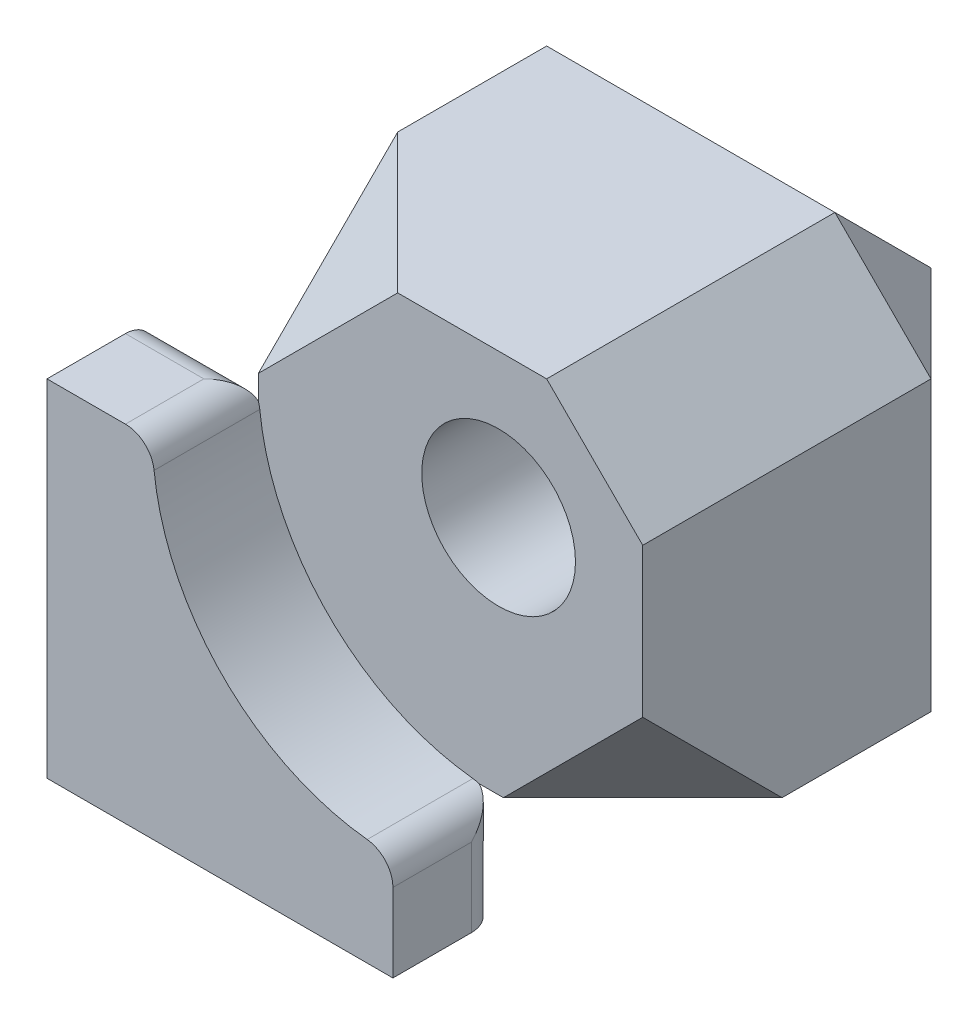
ISO-10303-21;
HEADER;
FILE_DESCRIPTION(('STEP AP214'),'2;1');
FILE_NAME('part.step','',(''),(''),'','','');
FILE_SCHEMA(('AUTOMOTIVE_DESIGN { 1 0 10303 214 1 1 1 1 }'));
ENDSEC;
DATA;
#1=APPLICATION_CONTEXT('core data for automotive mechanical design processes');
#2=APPLICATION_PROTOCOL_DEFINITION('international standard','automotive_design',2000,#1);
#3=PRODUCT_CONTEXT('',#1,'mechanical');
#4=PRODUCT('Part','Part','',(#3));
#5=PRODUCT_RELATED_PRODUCT_CATEGORY('part','',(#4));
#6=PRODUCT_DEFINITION_FORMATION('','',#4);
#7=PRODUCT_DEFINITION_CONTEXT('part definition',#1,'design');
#8=PRODUCT_DEFINITION('design','',#6,#7);
#9=PRODUCT_DEFINITION_SHAPE('','',#8);
#10=(LENGTH_UNIT() NAMED_UNIT(*) SI_UNIT(.MILLI.,.METRE.));
#11=(NAMED_UNIT(*) PLANE_ANGLE_UNIT() SI_UNIT($,.RADIAN.));
#12=(NAMED_UNIT(*) SI_UNIT($,.STERADIAN.) SOLID_ANGLE_UNIT());
#13=UNCERTAINTY_MEASURE_WITH_UNIT(LENGTH_MEASURE(1.E-05),#10,'distance_accuracy_value','');
#14=(GEOMETRIC_REPRESENTATION_CONTEXT(3) GLOBAL_UNCERTAINTY_ASSIGNED_CONTEXT((#13)) GLOBAL_UNIT_ASSIGNED_CONTEXT((#10,
#11,#12)) REPRESENTATION_CONTEXT('',''));
#15=CARTESIAN_POINT('',(0.,0.,0.));
#16=DIRECTION('',(0.,0.,1.));
#17=DIRECTION('',(1.,0.,0.));
#18=AXIS2_PLACEMENT_3D('',#15,#16,#17);
#19=CARTESIAN_POINT('',(0.,-2.50000000000001,7.5));
#20=DIRECTION('',(-1.,0.,0.));
#21=DIRECTION('',(0.,1.,0.));
#22=AXIS2_PLACEMENT_3D('',#19,#20,#21);
#23=PLANE('',#22);
#24=DIRECTION('',(0.,0.,1.));
#25=VECTOR('',#24,1.);
#26=CARTESIAN_POINT('',(0.,-2.20000000000001,7.5));
#27=LINE('',#26,#25);
#28=CARTESIAN_POINT('',(0.,-2.20000000000001,5.56776436283003));
#29=VERTEX_POINT('',#28);
#30=CARTESIAN_POINT('',(0.,-2.20000000000001,7.2));
#31=VERTEX_POINT('',#30);
#32=EDGE_CURVE('E70',#29,#31,#27,.T.);
#33=ORIENTED_EDGE('',*,*,#32,.F.);
#34=DIRECTION('',(0.,1.,0.));
#35=VECTOR('',#34,1.);
#36=CARTESIAN_POINT('',(0.,-2.50000000000001,5.56776436283003));
#37=LINE('',#36,#35);
#38=CARTESIAN_POINT('',(0.,-0.567764362830031,5.56776436283003));
#39=VERTEX_POINT('',#38);
#40=EDGE_CURVE('E267',#29,#39,#37,.T.);
#41=ORIENTED_EDGE('',*,*,#40,.T.);
#42=DIRECTION('',(0.,0.,-1.));
#43=VECTOR('',#42,1.);
#44=CARTESIAN_POINT('',(0.,-0.567764362830031,7.5));
#45=LINE('',#44,#43);
#46=CARTESIAN_POINT('',(0.,-0.56776436283003,7.2));
#47=VERTEX_POINT('',#46);
#48=EDGE_CURVE('E288',#39,#47,#45,.F.);
#49=ORIENTED_EDGE('',*,*,#48,.T.);
#50=DIRECTION('',(0.,1.,0.));
#51=VECTOR('',#50,1.);
#52=CARTESIAN_POINT('',(0.,-2.50000000000001,7.2));
#53=LINE('',#52,#51);
#54=EDGE_CURVE('E457',#31,#47,#53,.T.);
#55=ORIENTED_EDGE('',*,*,#54,.F.);
#56=EDGE_LOOP('',(#33,#41,#49,#55));
#57=FACE_BOUND('',#56,.T.);
#58=ADVANCED_FACE('F51',(#57),#23,.F.);
#59=CARTESIAN_POINT('',(-7.20000000000001,0.,0.));
#60=DIRECTION('',(-1.,0.,0.));
#61=DIRECTION('',(0.,-1.,0.));
#62=AXIS2_PLACEMENT_3D('',#59,#60,#61);
#63=PLANE('',#62);
#64=DIRECTION('',(0.,-1.,0.));
#65=VECTOR('',#64,1.);
#66=CARTESIAN_POINT('',(-7.20000000000001,-2.5,0.));
#67=LINE('',#66,#65);
#68=CARTESIAN_POINT('',(-7.20000000000001,-0.567764362830022,0.));
#69=VERTEX_POINT('',#68);
#70=CARTESIAN_POINT('',(-7.20000000000001,-2.20000000000001,0.));
#71=VERTEX_POINT('',#70);
#72=EDGE_CURVE('E212',#69,#71,#67,.T.);
#73=ORIENTED_EDGE('',*,*,#72,.T.);
#74=DIRECTION('',(0.,0.,1.));
#75=VECTOR('',#74,1.);
#76=CARTESIAN_POINT('',(-7.20000000000001,-2.20000000000001,0.));
#77=LINE('',#76,#75);
#78=CARTESIAN_POINT('',(-7.20000000000001,-2.20000000000001,7.2));
#79=VERTEX_POINT('',#78);
#80=EDGE_CURVE('E203',#71,#79,#77,.T.);
#81=ORIENTED_EDGE('',*,*,#80,.T.);
#82=DIRECTION('',(0.,1.,0.));
#83=VECTOR('',#82,1.);
#84=CARTESIAN_POINT('',(-7.20000000000001,0.,7.2));
#85=LINE('',#84,#83);
#86=CARTESIAN_POINT('',(-7.20000000000001,4.99999999999999,7.2));
#87=VERTEX_POINT('',#86);
#88=EDGE_CURVE('E58',#79,#87,#85,.T.);
#89=ORIENTED_EDGE('',*,*,#88,.T.);
#90=DIRECTION('',(0.,0.,-1.));
#91=VECTOR('',#90,1.);
#92=CARTESIAN_POINT('',(-7.20000000000001,4.99999999999999,7.5));
#93=LINE('',#92,#91);
#94=CARTESIAN_POINT('',(-7.20000000000001,4.99999999999999,5.56776436283002));
#95=VERTEX_POINT('',#94);
#96=EDGE_CURVE('E356',#87,#95,#93,.T.);
#97=ORIENTED_EDGE('',*,*,#96,.T.);
#98=CARTESIAN_POINT('',(-7.20000000000001,4.39999999999999,5.56776436283002));
#99=DIRECTION('',(-1.,0.,0.));
#100=DIRECTION('',(0.,-1.,0.));
#101=AXIS2_PLACEMENT_3D('',#98,#99,#100);
#102=CIRCLE('',#101,0.6);
#103=CARTESIAN_POINT('',(-7.20000000000001,4.46428571428571,4.97121818109823));
#104=VERTEX_POINT('',#103);
#105=EDGE_CURVE('E443',#104,#95,#102,.F.);
#106=ORIENTED_EDGE('',*,*,#105,.F.);
#107=CARTESIAN_POINT('',(-7.20000000000001,5.00000000000001,0.));
#108=DIRECTION('',(-1.,0.,0.));
#109=DIRECTION('',(0.,-1.,0.));
#110=AXIS2_PLACEMENT_3D('',#107,#108,#109);
#111=CIRCLE('',#110,5.00000000000001);
#112=CARTESIAN_POINT('',(-7.20000000000001,0.028781818901767,0.535714285714285));
#113=VERTEX_POINT('',#112);
#114=EDGE_CURVE('E450',#104,#113,#111,.F.);
#115=ORIENTED_EDGE('',*,*,#114,.T.);
#116=CARTESIAN_POINT('',(-7.20000000000001,-0.567764362830021,0.6));
#117=DIRECTION('',(-1.,0.,0.));
#118=DIRECTION('',(0.,-1.,0.));
#119=AXIS2_PLACEMENT_3D('',#116,#117,#118);
#120=CIRCLE('',#119,0.6);
#121=EDGE_CURVE('E217',#69,#113,#120,.F.);
#122=ORIENTED_EDGE('',*,*,#121,.F.);
#123=EDGE_LOOP('',(#73,#81,#89,#97,#106,#115,#122));
#124=FACE_BOUND('',#123,.T.);
#125=ADVANCED_FACE('F206',(#124),#63,.T.);
#126=CARTESIAN_POINT('',(-7.5,-2.5,0.));
#127=DIRECTION('',(0.,0.,1.));
#128=DIRECTION('',(0.,-1.,0.));
#129=AXIS2_PLACEMENT_3D('',#126,#127,#128);
#130=PLANE('',#129);
#131=DIRECTION('',(1.,0.,0.));
#132=VECTOR('',#131,1.);
#133=CARTESIAN_POINT('',(-7.5,-2.20000000000001,0.));
#134=LINE('',#133,#132);
#135=CARTESIAN_POINT('',(-5.56776436283003,-2.20000000000001,0.));
#136=VERTEX_POINT('',#135);
#137=EDGE_CURVE('E474',#71,#136,#134,.T.);
#138=ORIENTED_EDGE('',*,*,#137,.F.);
#139=ORIENTED_EDGE('',*,*,#72,.F.);
#140=DIRECTION('',(1.,0.,0.));
#141=VECTOR('',#140,1.);
#142=CARTESIAN_POINT('',(-7.5,-0.567764362830022,0.));
#143=LINE('',#142,#141);
#144=CARTESIAN_POINT('',(-5.56776436283003,-0.567764362830022,0.));
#145=VERTEX_POINT('',#144);
#146=EDGE_CURVE('E290',#69,#145,#143,.T.);
#147=ORIENTED_EDGE('',*,*,#146,.T.);
#148=DIRECTION('',(0.,1.,0.));
#149=VECTOR('',#148,1.);
#150=CARTESIAN_POINT('',(-5.56776436283003,-2.5,0.));
#151=LINE('',#150,#149);
#152=EDGE_CURVE('E317',#145,#136,#151,.F.);
#153=ORIENTED_EDGE('',*,*,#152,.T.);
#154=EDGE_LOOP('',(#138,#139,#147,#153));
#155=FACE_BOUND('',#154,.T.);
#156=ADVANCED_FACE('F586',(#155),#130,.F.);
#157=CARTESIAN_POINT('',(0.,-2.5,0.));
#158=DIRECTION('',(0.,1.,0.));
#159=DIRECTION('',(1.,0.,0.));
#160=AXIS2_PLACEMENT_3D('',#157,#158,#159);
#161=CYLINDRICAL_SURFACE('',#160,5.00000000000001);
#162=CARTESIAN_POINT('',(0.,-2.20000000000001,0.));
#163=DIRECTION('',(0.,-1.,0.));
#164=DIRECTION('',(1.,0.,0.));
#165=AXIS2_PLACEMENT_3D('',#162,#163,#164);
#166=CIRCLE('',#165,5.00000000000001);
#167=CARTESIAN_POINT('',(-4.97121818109824,-2.20000000000001,0.535714285714286));
#168=VERTEX_POINT('',#167);
#169=CARTESIAN_POINT('',(-0.535714285714296,-2.20000000000001,4.97121818109824));
#170=VERTEX_POINT('',#169);
#171=EDGE_CURVE('E471',#168,#170,#166,.F.);
#172=ORIENTED_EDGE('',*,*,#171,.F.);
#173=DIRECTION('',(0.,1.,0.));
#174=VECTOR('',#173,1.);
#175=CARTESIAN_POINT('',(-4.97121818109824,-2.5,0.535714285714286));
#176=LINE('',#175,#174);
#177=CARTESIAN_POINT('',(-4.97121818109824,0.,0.535714285714286));
#178=VERTEX_POINT('',#177);
#179=EDGE_CURVE('E316',#168,#178,#176,.T.);
#180=ORIENTED_EDGE('',*,*,#179,.T.);
#181=CARTESIAN_POINT('',(0.,0.,0.));
#182=DIRECTION('',(0.,1.,0.));
#183=DIRECTION('',(1.,0.,0.));
#184=AXIS2_PLACEMENT_3D('',#181,#182,#183);
#185=CIRCLE('',#184,5.00000000000001);
#186=CARTESIAN_POINT('',(-0.535714285714296,0.,4.97121818109824));
#187=VERTEX_POINT('',#186);
#188=EDGE_CURVE('E341',#178,#187,#185,.T.);
#189=ORIENTED_EDGE('',*,*,#188,.T.);
#190=DIRECTION('',(0.,1.,0.));
#191=VECTOR('',#190,1.);
#192=CARTESIAN_POINT('',(-0.535714285714296,-2.5,4.97121818109824));
#193=LINE('',#192,#191);
#194=EDGE_CURVE('E265',#187,#170,#193,.F.);
#195=ORIENTED_EDGE('',*,*,#194,.T.);
#196=EDGE_LOOP('',(#172,#180,#189,#195));
#197=FACE_BOUND('',#196,.T.);
#198=ADVANCED_FACE('F487',(#197),#161,.F.);
#199=CARTESIAN_POINT('',(-5.56776436283003,-2.5,0.600000000000001));
#200=DIRECTION('',(0.,1.,0.));
#201=DIRECTION('',(0.,0.,1.));
#202=AXIS2_PLACEMENT_3D('',#199,#200,#201);
#203=CYLINDRICAL_SURFACE('',#202,0.6);
#204=ORIENTED_EDGE('',*,*,#179,.F.);
#205=CARTESIAN_POINT('',(-5.56776436283003,-2.20000000000001,0.600000000000001));
#206=DIRECTION('',(0.,-1.,0.));
#207=DIRECTION('',(1.,0.,0.));
#208=AXIS2_PLACEMENT_3D('',#205,#206,#207);
#209=CIRCLE('',#208,0.6);
#210=EDGE_CURVE('E468',#168,#136,#209,.F.);
#211=ORIENTED_EDGE('',*,*,#210,.T.);
#212=ORIENTED_EDGE('',*,*,#152,.F.);
#213=CARTESIAN_POINT('',(-5.56776436283003,-0.567764362830021,0.600000000000001));
#214=DIRECTION('',(-0.707106781186547,0.707106781186547,0.));
#215=DIRECTION('',(0.707106781186547,0.707106781186547,0.));
#216=AXIS2_PLACEMENT_3D('',#213,#214,#215);
#217=ELLIPSE('',#216,0.848528137423857,0.6);
#218=CARTESIAN_POINT('',(-5.,0.,0.40598034042849));
#219=VERTEX_POINT('',#218);
#220=EDGE_CURVE('E284',#145,#219,#217,.F.);
#221=ORIENTED_EDGE('',*,*,#220,.T.);
#222=CARTESIAN_POINT('',(-5.56776436283003,0.,0.600000000000001));
#223=DIRECTION('',(0.,-1.,0.));
#224=DIRECTION('',(0.,0.,-1.));
#225=AXIS2_PLACEMENT_3D('',#222,#223,#224);
#226=CIRCLE('',#225,0.6);
#227=EDGE_CURVE('E303',#178,#219,#226,.F.);
#228=ORIENTED_EDGE('',*,*,#227,.F.);
#229=EDGE_LOOP('',(#204,#211,#212,#221,#228));
#230=FACE_BOUND('',#229,.T.);
#231=ADVANCED_FACE('F499',(#230),#203,.T.);
#232=CARTESIAN_POINT('',(-0.600000000000011,-2.5,5.56776436283003));
#233=DIRECTION('',(0.,1.,0.));
#234=DIRECTION('',(0.,0.,1.));
#235=AXIS2_PLACEMENT_3D('',#232,#233,#234);
#236=CYLINDRICAL_SURFACE('',#235,0.6);
#237=ORIENTED_EDGE('',*,*,#40,.F.);
#238=CARTESIAN_POINT('',(-0.600000000000011,-2.20000000000001,5.56776436283003));
#239=DIRECTION('',(0.,-1.,0.));
#240=DIRECTION('',(1.,0.,0.));
#241=AXIS2_PLACEMENT_3D('',#238,#239,#240);
#242=CIRCLE('',#241,0.6);
#243=EDGE_CURVE('E477',#29,#170,#242,.F.);
#244=ORIENTED_EDGE('',*,*,#243,.T.);
#245=ORIENTED_EDGE('',*,*,#194,.F.);
#246=CARTESIAN_POINT('',(-0.600000000000011,0.,5.56776436283003));
#247=DIRECTION('',(0.,-1.,0.));
#248=DIRECTION('',(0.,0.,-1.));
#249=AXIS2_PLACEMENT_3D('',#246,#247,#248);
#250=CIRCLE('',#249,0.6);
#251=CARTESIAN_POINT('',(-0.405980340428505,0.,5.));
#252=VERTEX_POINT('',#251);
#253=EDGE_CURVE('E260',#252,#187,#250,.F.);
#254=ORIENTED_EDGE('',*,*,#253,.F.);
#255=CARTESIAN_POINT('',(-0.600000000000011,-0.56776436283003,5.56776436283003));
#256=DIRECTION('',(0.,-0.707106781186547,-0.707106781186547));
#257=DIRECTION('',(0.,0.707106781186547,-0.707106781186547));
#258=AXIS2_PLACEMENT_3D('',#255,#256,#257);
#259=ELLIPSE('',#258,0.848528137423857,0.6);
#260=EDGE_CURVE('E266',#39,#252,#259,.F.);
#261=ORIENTED_EDGE('',*,*,#260,.F.);
#262=EDGE_LOOP('',(#237,#244,#245,#254,#261));
#263=FACE_BOUND('',#262,.T.);
#264=ADVANCED_FACE('F52',(#263),#236,.T.);
#265=CARTESIAN_POINT('',(0.,0.,7.2));
#266=DIRECTION('',(0.,0.,1.));
#267=DIRECTION('',(1.,0.,0.));
#268=AXIS2_PLACEMENT_3D('',#265,#266,#267);
#269=PLANE('',#268);
#270=ORIENTED_EDGE('',*,*,#88,.F.);
#271=DIRECTION('',(1.,0.,0.));
#272=VECTOR('',#271,1.);
#273=CARTESIAN_POINT('',(0.,-2.20000000000001,7.2));
#274=LINE('',#273,#272);
#275=EDGE_CURVE('E11',#79,#31,#274,.T.);
#276=ORIENTED_EDGE('',*,*,#275,.T.);
#277=ORIENTED_EDGE('',*,*,#54,.T.);
#278=CARTESIAN_POINT('',(-0.60000000000001,-0.56776436283003,7.2));
#279=DIRECTION('',(0.,0.,1.));
#280=DIRECTION('',(1.,0.,0.));
#281=AXIS2_PLACEMENT_3D('',#278,#279,#280);
#282=CIRCLE('',#281,0.6);
#283=CARTESIAN_POINT('',(-0.535714285714295,0.0287818189017583,7.2));
#284=VERTEX_POINT('',#283);
#285=EDGE_CURVE('E455',#284,#47,#282,.F.);
#286=ORIENTED_EDGE('',*,*,#285,.F.);
#287=CARTESIAN_POINT('',(0.,5.,7.2));
#288=DIRECTION('',(0.,0.,1.));
#289=DIRECTION('',(1.,0.,0.));
#290=AXIS2_PLACEMENT_3D('',#287,#288,#289);
#291=CIRCLE('',#290,5.00000000000001);
#292=CARTESIAN_POINT('',(-4.97121818109824,4.46428571428571,7.2));
#293=VERTEX_POINT('',#292);
#294=EDGE_CURVE('E459',#284,#293,#291,.F.);
#295=ORIENTED_EDGE('',*,*,#294,.T.);
#296=CARTESIAN_POINT('',(-5.56776436283003,4.39999999999999,7.2));
#297=DIRECTION('',(0.,0.,1.));
#298=DIRECTION('',(1.,0.,0.));
#299=AXIS2_PLACEMENT_3D('',#296,#297,#298);
#300=CIRCLE('',#299,0.6);
#301=CARTESIAN_POINT('',(-5.56776436283003,4.99999999999999,7.2));
#302=VERTEX_POINT('',#301);
#303=EDGE_CURVE('E465',#302,#293,#300,.F.);
#304=ORIENTED_EDGE('',*,*,#303,.F.);
#305=DIRECTION('',(-1.,0.,0.));
#306=VECTOR('',#305,1.);
#307=CARTESIAN_POINT('',(-7.50000000000001,4.99999999999999,7.2));
#308=LINE('',#307,#306);
#309=EDGE_CURVE('E216',#302,#87,#308,.T.);
#310=ORIENTED_EDGE('',*,*,#309,.T.);
#311=EDGE_LOOP('',(#270,#276,#277,#286,#295,#304,#310));
#312=FACE_BOUND('',#311,.T.);
#313=ADVANCED_FACE('F211',(#312),#269,.T.);
#314=CARTESIAN_POINT('',(-7.50000000000001,4.99999999999999,7.5));
#315=DIRECTION('',(0.,-1.,0.));
#316=DIRECTION('',(-1.,0.,0.));
#317=AXIS2_PLACEMENT_3D('',#314,#315,#316);
#318=PLANE('',#317);
#319=ORIENTED_EDGE('',*,*,#309,.F.);
#320=DIRECTION('',(0.,0.,-1.));
#321=VECTOR('',#320,1.);
#322=CARTESIAN_POINT('',(-5.56776436283003,4.99999999999999,7.5));
#323=LINE('',#322,#321);
#324=CARTESIAN_POINT('',(-5.56776436283003,4.99999999999999,5.56776436283002));
#325=VERTEX_POINT('',#324);
#326=EDGE_CURVE('E314',#302,#325,#323,.T.);
#327=ORIENTED_EDGE('',*,*,#326,.T.);
#328=DIRECTION('',(1.,0.,0.));
#329=VECTOR('',#328,1.);
#330=CARTESIAN_POINT('',(-7.50000000000001,4.99999999999999,5.56776436283002));
#331=LINE('',#330,#329);
#332=EDGE_CURVE('E330',#325,#95,#331,.F.);
#333=ORIENTED_EDGE('',*,*,#332,.T.);
#334=ORIENTED_EDGE('',*,*,#96,.F.);
#335=EDGE_LOOP('',(#319,#327,#333,#334));
#336=FACE_BOUND('',#335,.T.);
#337=ADVANCED_FACE('F592',(#336),#318,.F.);
#338=CARTESIAN_POINT('',(0.,5.,7.5));
#339=DIRECTION('',(0.,0.,-1.));
#340=DIRECTION('',(0.,1.,0.));
#341=AXIS2_PLACEMENT_3D('',#338,#339,#340);
#342=CYLINDRICAL_SURFACE('',#341,5.00000000000001);
#343=ORIENTED_EDGE('',*,*,#294,.F.);
#344=DIRECTION('',(0.,0.,-1.));
#345=VECTOR('',#344,1.);
#346=CARTESIAN_POINT('',(-0.535714285714295,0.0287818189017583,7.5));
#347=LINE('',#346,#345);
#348=CARTESIAN_POINT('',(-0.535714285714295,0.0287818189017583,5.));
#349=VERTEX_POINT('',#348);
#350=EDGE_CURVE('E292',#284,#349,#347,.T.);
#351=ORIENTED_EDGE('',*,*,#350,.T.);
#352=CARTESIAN_POINT('',(0.,5.,5.));
#353=DIRECTION('',(0.,0.,-1.));
#354=DIRECTION('',(0.,1.,0.));
#355=AXIS2_PLACEMENT_3D('',#352,#353,#354);
#356=CIRCLE('',#355,5.00000000000001);
#357=CARTESIAN_POINT('',(-4.97121818109824,4.46428571428571,5.));
#358=VERTEX_POINT('',#357);
#359=EDGE_CURVE('E335',#349,#358,#356,.T.);
#360=ORIENTED_EDGE('',*,*,#359,.T.);
#361=DIRECTION('',(0.,0.,-1.));
#362=VECTOR('',#361,1.);
#363=CARTESIAN_POINT('',(-4.97121818109824,4.46428571428571,7.5));
#364=LINE('',#363,#362);
#365=EDGE_CURVE('E302',#358,#293,#364,.F.);
#366=ORIENTED_EDGE('',*,*,#365,.T.);
#367=EDGE_LOOP('',(#343,#351,#360,#366));
#368=FACE_BOUND('',#367,.T.);
#369=ADVANCED_FACE('F595',(#368),#342,.F.);
#370=CARTESIAN_POINT('',(-5.56776436283003,4.39999999999999,7.5));
#371=DIRECTION('',(0.,0.,-1.));
#372=DIRECTION('',(-1.,0.,0.));
#373=AXIS2_PLACEMENT_3D('',#370,#371,#372);
#374=CYLINDRICAL_SURFACE('',#373,0.6);
#375=ORIENTED_EDGE('',*,*,#326,.F.);
#376=ORIENTED_EDGE('',*,*,#303,.T.);
#377=ORIENTED_EDGE('',*,*,#365,.F.);
#378=CARTESIAN_POINT('',(-5.56776436283003,4.39999999999999,5.));
#379=DIRECTION('',(0.,0.,-1.));
#380=DIRECTION('',(-1.,0.,0.));
#381=AXIS2_PLACEMENT_3D('',#378,#379,#380);
#382=CIRCLE('',#381,0.6);
#383=CARTESIAN_POINT('',(-5.,4.59401965957153,5.));
#384=VERTEX_POINT('',#383);
#385=EDGE_CURVE('E299',#384,#358,#382,.T.);
#386=ORIENTED_EDGE('',*,*,#385,.F.);
#387=CARTESIAN_POINT('',(-5.56776436283003,4.39999999999999,5.56776436283002));
#388=DIRECTION('',(0.707106781186547,0.,0.707106781186547));
#389=DIRECTION('',(0.707106781186547,0.,-0.707106781186547));
#390=AXIS2_PLACEMENT_3D('',#387,#388,#389);
#391=ELLIPSE('',#390,0.848528137423857,0.6);
#392=EDGE_CURVE('E309',#325,#384,#391,.F.);
#393=ORIENTED_EDGE('',*,*,#392,.F.);
#394=EDGE_LOOP('',(#375,#376,#377,#386,#393));
#395=FACE_BOUND('',#394,.T.);
#396=ADVANCED_FACE('F528',(#395),#374,.T.);
#397=CARTESIAN_POINT('',(-0.60000000000001,-0.56776436283003,7.5));
#398=DIRECTION('',(0.,0.,-1.));
#399=DIRECTION('',(-1.,0.,0.));
#400=AXIS2_PLACEMENT_3D('',#397,#398,#399);
#401=CYLINDRICAL_SURFACE('',#400,0.6);
#402=ORIENTED_EDGE('',*,*,#350,.F.);
#403=ORIENTED_EDGE('',*,*,#285,.T.);
#404=ORIENTED_EDGE('',*,*,#48,.F.);
#405=ORIENTED_EDGE('',*,*,#260,.T.);
#406=CARTESIAN_POINT('',(-0.60000000000001,-0.56776436283003,5.));
#407=DIRECTION('',(0.,0.,-1.));
#408=DIRECTION('',(-1.,0.,0.));
#409=AXIS2_PLACEMENT_3D('',#406,#407,#408);
#410=CIRCLE('',#409,0.6);
#411=EDGE_CURVE('E274',#349,#252,#410,.T.);
#412=ORIENTED_EDGE('',*,*,#411,.F.);
#413=EDGE_LOOP('',(#402,#403,#404,#405,#412));
#414=FACE_BOUND('',#413,.T.);
#415=ADVANCED_FACE('F604',(#414),#401,.T.);
#416=CARTESIAN_POINT('',(-7.5,5.00000000000001,0.));
#417=DIRECTION('',(1.,0.,0.));
#418=DIRECTION('',(0.,0.,-1.));
#419=AXIS2_PLACEMENT_3D('',#416,#417,#418);
#420=CYLINDRICAL_SURFACE('',#419,5.00000000000001);
#421=ORIENTED_EDGE('',*,*,#114,.F.);
#422=DIRECTION('',(1.,0.,0.));
#423=VECTOR('',#422,1.);
#424=CARTESIAN_POINT('',(-7.5,4.46428571428571,4.97121818109823));
#425=LINE('',#424,#423);
#426=CARTESIAN_POINT('',(-5.,4.46428571428571,4.97121818109823));
#427=VERTEX_POINT('',#426);
#428=EDGE_CURVE('E333',#104,#427,#425,.T.);
#429=ORIENTED_EDGE('',*,*,#428,.T.);
#430=CARTESIAN_POINT('',(-5.,5.00000000000001,0.));
#431=DIRECTION('',(1.,0.,0.));
#432=DIRECTION('',(0.,0.,-1.));
#433=AXIS2_PLACEMENT_3D('',#430,#431,#432);
#434=CIRCLE('',#433,5.00000000000001);
#435=CARTESIAN_POINT('',(-5.,0.028781818901767,0.535714285714285));
#436=VERTEX_POINT('',#435);
#437=EDGE_CURVE('E340',#427,#436,#434,.T.);
#438=ORIENTED_EDGE('',*,*,#437,.T.);
#439=DIRECTION('',(1.,0.,0.));
#440=VECTOR('',#439,1.);
#441=CARTESIAN_POINT('',(-7.5,0.028781818901767,0.535714285714285));
#442=LINE('',#441,#440);
#443=EDGE_CURVE('E278',#436,#113,#442,.F.);
#444=ORIENTED_EDGE('',*,*,#443,.T.);
#445=EDGE_LOOP('',(#421,#429,#438,#444));
#446=FACE_BOUND('',#445,.T.);
#447=ADVANCED_FACE('F514',(#446),#420,.F.);
#448=CARTESIAN_POINT('',(-7.5,4.39999999999999,5.56776436283002));
#449=DIRECTION('',(1.,0.,0.));
#450=DIRECTION('',(0.,0.,-1.));
#451=AXIS2_PLACEMENT_3D('',#448,#449,#450);
#452=CYLINDRICAL_SURFACE('',#451,0.6);
#453=ORIENTED_EDGE('',*,*,#428,.F.);
#454=ORIENTED_EDGE('',*,*,#105,.T.);
#455=ORIENTED_EDGE('',*,*,#332,.F.);
#456=ORIENTED_EDGE('',*,*,#392,.T.);
#457=CARTESIAN_POINT('',(-5.,4.39999999999999,5.56776436283002));
#458=DIRECTION('',(1.,0.,0.));
#459=DIRECTION('',(0.,0.,-1.));
#460=AXIS2_PLACEMENT_3D('',#457,#458,#459);
#461=CIRCLE('',#460,0.6);
#462=EDGE_CURVE('E322',#427,#384,#461,.T.);
#463=ORIENTED_EDGE('',*,*,#462,.F.);
#464=EDGE_LOOP('',(#453,#454,#455,#456,#463));
#465=FACE_BOUND('',#464,.T.);
#466=ADVANCED_FACE('F520',(#465),#452,.T.);
#467=CARTESIAN_POINT('',(-7.5,-0.567764362830021,0.6));
#468=DIRECTION('',(1.,0.,0.));
#469=DIRECTION('',(0.,0.,-1.));
#470=AXIS2_PLACEMENT_3D('',#467,#468,#469);
#471=CYLINDRICAL_SURFACE('',#470,0.6);
#472=ORIENTED_EDGE('',*,*,#146,.F.);
#473=ORIENTED_EDGE('',*,*,#121,.T.);
#474=ORIENTED_EDGE('',*,*,#443,.F.);
#475=CARTESIAN_POINT('',(-5.,-0.567764362830021,0.6));
#476=DIRECTION('',(1.,0.,0.));
#477=DIRECTION('',(0.,0.,-1.));
#478=AXIS2_PLACEMENT_3D('',#475,#476,#477);
#479=CIRCLE('',#478,0.6);
#480=EDGE_CURVE('E275',#219,#436,#479,.T.);
#481=ORIENTED_EDGE('',*,*,#480,.F.);
#482=ORIENTED_EDGE('',*,*,#220,.F.);
#483=EDGE_LOOP('',(#472,#473,#474,#481,#482));
#484=FACE_BOUND('',#483,.T.);
#485=ADVANCED_FACE('F504',(#484),#471,.T.);
#486=CARTESIAN_POINT('',(0.,0.,0.));
#487=DIRECTION('',(0.,-1.,0.));
#488=DIRECTION('',(0.,0.,-1.));
#489=AXIS2_PLACEMENT_3D('',#486,#487,#488);
#490=PLANE('',#489);
#491=CARTESIAN_POINT('',(0.,0.,0.));
#492=DIRECTION('',(0.,-1.,0.));
#493=DIRECTION('',(0.,0.,-1.));
#494=AXIS2_PLACEMENT_3D('',#491,#492,#493);
#495=CIRCLE('',#494,1.6);
#496=CARTESIAN_POINT('',(0.,0.,-1.6));
#497=VERTEX_POINT('',#496);
#498=EDGE_CURVE('E407',#497,#497,#495,.T.);
#499=ORIENTED_EDGE('',*,*,#498,.F.);
#500=EDGE_LOOP('',(#499));
#501=FACE_BOUND('',#500,.T.);
#502=DIRECTION('',(0.,0.,1.));
#503=VECTOR('',#502,1.);
#504=CARTESIAN_POINT('',(-5.,0.,5.));
#505=LINE('',#504,#503);
#506=CARTESIAN_POINT('',(-5.,0.,-0.100000000000001));
#507=VERTEX_POINT('',#506);
#508=EDGE_CURVE('E394',#507,#219,#505,.T.);
#509=ORIENTED_EDGE('',*,*,#508,.F.);
#510=DIRECTION('',(0.707106781186548,0.,-0.707106781186548));
#511=VECTOR('',#510,1.);
#512=CARTESIAN_POINT('',(-2.55,0.,-2.55));
#513=LINE('',#512,#511);
#514=CARTESIAN_POINT('',(-2.10000000000001,0.,-3.));
#515=VERTEX_POINT('',#514);
#516=EDGE_CURVE('E235',#507,#515,#513,.T.);
#517=ORIENTED_EDGE('',*,*,#516,.T.);
#518=DIRECTION('',(-1.,0.,0.));
#519=VECTOR('',#518,1.);
#520=CARTESIAN_POINT('',(19.142135623731,0.,-3.));
#521=LINE('',#520,#519);
#522=CARTESIAN_POINT('',(0.999999999999994,0.,-3.));
#523=VERTEX_POINT('',#522);
#524=EDGE_CURVE('E423',#523,#515,#521,.T.);
#525=ORIENTED_EDGE('',*,*,#524,.F.);
#526=DIRECTION('',(-0.707106781186549,0.,-0.707106781186546));
#527=VECTOR('',#526,1.);
#528=CARTESIAN_POINT('',(2.,0.,-2.));
#529=LINE('',#528,#527);
#530=CARTESIAN_POINT('',(3.,0.,-1.));
#531=VERTEX_POINT('',#530);
#532=EDGE_CURVE('E365',#523,#531,#529,.F.);
#533=ORIENTED_EDGE('',*,*,#532,.T.);
#534=DIRECTION('',(0.,0.,1.));
#535=VECTOR('',#534,1.);
#536=CARTESIAN_POINT('',(3.,0.,-11.2462112512353));
#537=LINE('',#536,#535);
#538=CARTESIAN_POINT('',(3.,0.,2.1));
#539=VERTEX_POINT('',#538);
#540=EDGE_CURVE('E433',#531,#539,#537,.T.);
#541=ORIENTED_EDGE('',*,*,#540,.T.);
#542=DIRECTION('',(-0.707106781186547,0.,0.707106781186547));
#543=VECTOR('',#542,1.);
#544=CARTESIAN_POINT('',(2.55,0.,2.55));
#545=LINE('',#544,#543);
#546=CARTESIAN_POINT('',(0.100000000000001,0.,5.));
#547=VERTEX_POINT('',#546);
#548=EDGE_CURVE('E242',#539,#547,#545,.T.);
#549=ORIENTED_EDGE('',*,*,#548,.T.);
#550=DIRECTION('',(1.,0.,0.));
#551=VECTOR('',#550,1.);
#552=CARTESIAN_POINT('',(-5.,0.,5.));
#553=LINE('',#552,#551);
#554=EDGE_CURVE('E391',#252,#547,#553,.T.);
#555=ORIENTED_EDGE('',*,*,#554,.F.);
#556=ORIENTED_EDGE('',*,*,#253,.T.);
#557=ORIENTED_EDGE('',*,*,#188,.F.);
#558=ORIENTED_EDGE('',*,*,#227,.T.);
#559=EDGE_LOOP('',(#509,#517,#525,#533,#541,#549,#555,#556,#557,#558));
#560=FACE_BOUND('',#559,.T.);
#561=ADVANCED_FACE('F496',(#501,#560),#490,.T.);
#562=CARTESIAN_POINT('',(-5.,10.,5.));
#563=DIRECTION('',(1.,0.,0.));
#564=DIRECTION('',(0.,0.,-1.));
#565=AXIS2_PLACEMENT_3D('',#562,#563,#564);
#566=PLANE('',#565);
#567=DIRECTION('',(0.,0.707106781186548,-0.707106781186547));
#568=VECTOR('',#567,1.);
#569=CARTESIAN_POINT('',(-5.,2.45,-2.55));
#570=LINE('',#569,#568);
#571=CARTESIAN_POINT('',(-5.,2.89999999999999,-3.));
#572=VERTEX_POINT('',#571);
#573=EDGE_CURVE('E226',#507,#572,#570,.T.);
#574=ORIENTED_EDGE('',*,*,#573,.F.);
#575=ORIENTED_EDGE('',*,*,#508,.T.);
#576=ORIENTED_EDGE('',*,*,#480,.T.);
#577=ORIENTED_EDGE('',*,*,#437,.F.);
#578=ORIENTED_EDGE('',*,*,#462,.T.);
#579=DIRECTION('',(0.,-1.,0.));
#580=VECTOR('',#579,1.);
#581=CARTESIAN_POINT('',(-5.,10.,5.));
#582=LINE('',#581,#580);
#583=CARTESIAN_POINT('',(-5.,5.1,5.));
#584=VERTEX_POINT('',#583);
#585=EDGE_CURVE('E389',#584,#384,#582,.T.);
#586=ORIENTED_EDGE('',*,*,#585,.F.);
#587=DIRECTION('',(0.,-0.707106781186547,0.707106781186548));
#588=VECTOR('',#587,1.);
#589=CARTESIAN_POINT('',(-5.,7.55,2.55));
#590=LINE('',#589,#588);
#591=CARTESIAN_POINT('',(-5.,8.,2.09999999999999));
#592=VERTEX_POINT('',#591);
#593=EDGE_CURVE('E254',#592,#584,#590,.T.);
#594=ORIENTED_EDGE('',*,*,#593,.F.);
#595=DIRECTION('',(0.,0.,1.));
#596=VECTOR('',#595,1.);
#597=CARTESIAN_POINT('',(-5.,8.,5.));
#598=LINE('',#597,#596);
#599=CARTESIAN_POINT('',(-5.,8.,-0.999999999999993));
#600=VERTEX_POINT('',#599);
#601=EDGE_CURVE('E426',#600,#592,#598,.T.);
#602=ORIENTED_EDGE('',*,*,#601,.F.);
#603=DIRECTION('',(0.,0.707106781186546,0.707106781186549));
#604=VECTOR('',#603,1.);
#605=CARTESIAN_POINT('',(-5.,8.,-0.999999999999993));
#606=LINE('',#605,#604);
#607=CARTESIAN_POINT('',(-5.,6.,-3.));
#608=VERTEX_POINT('',#607);
#609=EDGE_CURVE('E380',#600,#608,#606,.F.);
#610=ORIENTED_EDGE('',*,*,#609,.T.);
#611=DIRECTION('',(0.,1.,0.));
#612=VECTOR('',#611,1.);
#613=CARTESIAN_POINT('',(-5.,8.,-3.));
#614=LINE('',#613,#612);
#615=EDGE_CURVE('E435',#572,#608,#614,.T.);
#616=ORIENTED_EDGE('',*,*,#615,.F.);
#617=EDGE_LOOP('',(#574,#575,#576,#577,#578,#586,#594,#602,#610,#616));
#618=FACE_BOUND('',#617,.T.);
#619=CARTESIAN_POINT('',(-5.,5.,0.));
#620=DIRECTION('',(1.,0.,0.));
#621=DIRECTION('',(0.,0.,-1.));
#622=AXIS2_PLACEMENT_3D('',#619,#620,#621);
#623=CIRCLE('',#622,1.6);
#624=CARTESIAN_POINT('',(-5.,5.,-1.6));
#625=VERTEX_POINT('',#624);
#626=EDGE_CURVE('E412',#625,#625,#623,.T.);
#627=ORIENTED_EDGE('',*,*,#626,.T.);
#628=EDGE_LOOP('',(#627));
#629=FACE_BOUND('',#628,.T.);
#630=ADVANCED_FACE('F506',(#618,#629),#566,.F.);
#631=CARTESIAN_POINT('',(-5.,10.,5.));
#632=DIRECTION('',(0.,0.,-1.));
#633=DIRECTION('',(-1.,0.,0.));
#634=AXIS2_PLACEMENT_3D('',#631,#632,#633);
#635=PLANE('',#634);
#636=DIRECTION('',(-0.707106781186547,-0.707106781186547,0.));
#637=VECTOR('',#636,1.);
#638=CARTESIAN_POINT('',(2.55,2.45,5.));
#639=LINE('',#638,#637);
#640=CARTESIAN_POINT('',(3.,2.9,5.));
#641=VERTEX_POINT('',#640);
#642=EDGE_CURVE('E238',#641,#547,#639,.T.);
#643=ORIENTED_EDGE('',*,*,#642,.F.);
#644=DIRECTION('',(0.,-1.,0.));
#645=VECTOR('',#644,1.);
#646=CARTESIAN_POINT('',(3.,8.,5.));
#647=LINE('',#646,#645);
#648=CARTESIAN_POINT('',(3.,6.,5.));
#649=VERTEX_POINT('',#648);
#650=EDGE_CURVE('E349',#649,#641,#647,.T.);
#651=ORIENTED_EDGE('',*,*,#650,.F.);
#652=DIRECTION('',(0.707106781186549,-0.707106781186546,0.));
#653=VECTOR('',#652,1.);
#654=CARTESIAN_POINT('',(3.,6.,5.));
#655=LINE('',#654,#653);
#656=CARTESIAN_POINT('',(0.999999999999994,8.,5.));
#657=VERTEX_POINT('',#656);
#658=EDGE_CURVE('E344',#649,#657,#655,.F.);
#659=ORIENTED_EDGE('',*,*,#658,.T.);
#660=DIRECTION('',(-1.,0.,0.));
#661=VECTOR('',#660,1.);
#662=CARTESIAN_POINT('',(19.142135623731,8.,5.));
#663=LINE('',#662,#661);
#664=CARTESIAN_POINT('',(-2.09999999999999,8.,5.));
#665=VERTEX_POINT('',#664);
#666=EDGE_CURVE('E417',#657,#665,#663,.T.);
#667=ORIENTED_EDGE('',*,*,#666,.T.);
#668=DIRECTION('',(0.707106781186548,0.707106781186547,0.));
#669=VECTOR('',#668,1.);
#670=CARTESIAN_POINT('',(-2.55,7.55,5.));
#671=LINE('',#670,#669);
#672=EDGE_CURVE('E251',#584,#665,#671,.T.);
#673=ORIENTED_EDGE('',*,*,#672,.F.);
#674=ORIENTED_EDGE('',*,*,#585,.T.);
#675=ORIENTED_EDGE('',*,*,#385,.T.);
#676=ORIENTED_EDGE('',*,*,#359,.F.);
#677=ORIENTED_EDGE('',*,*,#411,.T.);
#678=ORIENTED_EDGE('',*,*,#554,.T.);
#679=EDGE_LOOP('',(#643,#651,#659,#667,#673,#674,#675,#676,#677,#678));
#680=FACE_BOUND('',#679,.T.);
#681=CARTESIAN_POINT('',(0.,5.,5.));
#682=DIRECTION('',(0.,0.,1.));
#683=DIRECTION('',(1.,0.,0.));
#684=AXIS2_PLACEMENT_3D('',#681,#682,#683);
#685=CIRCLE('',#684,1.6);
#686=CARTESIAN_POINT('',(1.6,5.,5.));
#687=VERTEX_POINT('',#686);
#688=EDGE_CURVE('E400',#687,#687,#685,.T.);
#689=ORIENTED_EDGE('',*,*,#688,.F.);
#690=EDGE_LOOP('',(#689));
#691=FACE_BOUND('',#690,.T.);
#692=ADVANCED_FACE('F527',(#680,#691),#635,.F.);
#693=CARTESIAN_POINT('',(0.,5.,1.8));
#694=DIRECTION('',(0.,0.,1.));
#695=DIRECTION('',(1.,0.,0.));
#696=AXIS2_PLACEMENT_3D('',#693,#694,#695);
#697=CYLINDRICAL_SURFACE('',#696,1.6);
#698=CARTESIAN_POINT('',(0.,5.,1.8));
#699=DIRECTION('',(0.,0.,1.));
#700=DIRECTION('',(1.,0.,0.));
#701=AXIS2_PLACEMENT_3D('',#698,#699,#700);
#702=CIRCLE('',#701,1.6);
#703=CARTESIAN_POINT('',(1.6,5.,1.8));
#704=VERTEX_POINT('',#703);
#705=EDGE_CURVE('E397',#704,#704,#702,.T.);
#706=ORIENTED_EDGE('',*,*,#705,.F.);
#707=EDGE_LOOP('',(#706));
#708=FACE_BOUND('',#707,.T.);
#709=ORIENTED_EDGE('',*,*,#688,.T.);
#710=EDGE_LOOP('',(#709));
#711=FACE_BOUND('',#710,.T.);
#712=ADVANCED_FACE('F617',(#708,#711),#697,.F.);
#713=CARTESIAN_POINT('',(0.,5.,1.8));
#714=DIRECTION('',(0.,0.,1.));
#715=DIRECTION('',(1.,0.,0.));
#716=AXIS2_PLACEMENT_3D('',#713,#714,#715);
#717=PLANE('',#716);
#718=ORIENTED_EDGE('',*,*,#705,.T.);
#719=EDGE_LOOP('',(#718));
#720=FACE_BOUND('',#719,.T.);
#721=ADVANCED_FACE('F775',(#720),#717,.T.);
#722=CARTESIAN_POINT('',(0.,3.2,0.));
#723=DIRECTION('',(0.,-1.,0.));
#724=DIRECTION('',(0.,0.,-1.));
#725=AXIS2_PLACEMENT_3D('',#722,#723,#724);
#726=CYLINDRICAL_SURFACE('',#725,1.6);
#727=CARTESIAN_POINT('',(0.,3.2,0.));
#728=DIRECTION('',(0.,-1.,0.));
#729=DIRECTION('',(0.,0.,-1.));
#730=AXIS2_PLACEMENT_3D('',#727,#728,#729);
#731=CIRCLE('',#730,1.6);
#732=CARTESIAN_POINT('',(0.,3.2,-1.6));
#733=VERTEX_POINT('',#732);
#734=EDGE_CURVE('E402',#733,#733,#731,.T.);
#735=ORIENTED_EDGE('',*,*,#734,.F.);
#736=EDGE_LOOP('',(#735));
#737=FACE_BOUND('',#736,.T.);
#738=ORIENTED_EDGE('',*,*,#498,.T.);
#739=EDGE_LOOP('',(#738));
#740=FACE_BOUND('',#739,.T.);
#741=ADVANCED_FACE('F770',(#737,#740),#726,.F.);
#742=CARTESIAN_POINT('',(0.,3.2,0.));
#743=DIRECTION('',(0.,-1.,0.));
#744=DIRECTION('',(0.,0.,-1.));
#745=AXIS2_PLACEMENT_3D('',#742,#743,#744);
#746=PLANE('',#745);
#747=ORIENTED_EDGE('',*,*,#734,.T.);
#748=EDGE_LOOP('',(#747));
#749=FACE_BOUND('',#748,.T.);
#750=ADVANCED_FACE('F758',(#749),#746,.T.);
#751=CARTESIAN_POINT('',(-1.8,5.,0.));
#752=DIRECTION('',(-1.,0.,0.));
#753=DIRECTION('',(0.,0.,1.));
#754=AXIS2_PLACEMENT_3D('',#751,#752,#753);
#755=CYLINDRICAL_SURFACE('',#754,1.6);
#756=CARTESIAN_POINT('',(-1.8,5.,0.));
#757=DIRECTION('',(1.,0.,0.));
#758=DIRECTION('',(0.,0.,-1.));
#759=AXIS2_PLACEMENT_3D('',#756,#757,#758);
#760=CIRCLE('',#759,1.6);
#761=CARTESIAN_POINT('',(-1.8,5.,-1.6));
#762=VERTEX_POINT('',#761);
#763=EDGE_CURVE('E413',#762,#762,#760,.T.);
#764=ORIENTED_EDGE('',*,*,#763,.T.);
#765=EDGE_LOOP('',(#764));
#766=FACE_BOUND('',#765,.T.);
#767=ORIENTED_EDGE('',*,*,#626,.F.);
#768=EDGE_LOOP('',(#767));
#769=FACE_BOUND('',#768,.T.);
#770=ADVANCED_FACE('F754',(#766,#769),#755,.F.);
#771=CARTESIAN_POINT('',(-1.8,5.,0.));
#772=DIRECTION('',(1.,0.,0.));
#773=DIRECTION('',(0.,0.,-1.));
#774=AXIS2_PLACEMENT_3D('',#771,#772,#773);
#775=PLANE('',#774);
#776=ORIENTED_EDGE('',*,*,#763,.F.);
#777=EDGE_LOOP('',(#776));
#778=FACE_BOUND('',#777,.T.);
#779=ADVANCED_FACE('F748',(#778),#775,.F.);
#780=CARTESIAN_POINT('',(19.142135623731,8.,5.));
#781=DIRECTION('',(0.,-1.,0.));
#782=DIRECTION('',(0.,0.,-1.));
#783=AXIS2_PLACEMENT_3D('',#780,#781,#782);
#784=PLANE('',#783);
#785=DIRECTION('',(-0.707106781186548,0.,-0.707106781186547));
#786=VECTOR('',#785,1.);
#787=CARTESIAN_POINT('',(8.52106781186548,8.,15.6210678118655));
#788=LINE('',#787,#786);
#789=EDGE_CURVE('E249',#665,#592,#788,.T.);
#790=ORIENTED_EDGE('',*,*,#789,.F.);
#791=ORIENTED_EDGE('',*,*,#666,.F.);
#792=DIRECTION('',(0.,0.,-1.));
#793=VECTOR('',#792,1.);
#794=CARTESIAN_POINT('',(0.999999999999994,8.,5.));
#795=LINE('',#794,#793);
#796=CARTESIAN_POINT('',(0.999999999999994,8.,-0.999999999999993));
#797=VERTEX_POINT('',#796);
#798=EDGE_CURVE('E383',#657,#797,#795,.T.);
#799=ORIENTED_EDGE('',*,*,#798,.T.);
#800=DIRECTION('',(-1.,0.,0.));
#801=VECTOR('',#800,1.);
#802=CARTESIAN_POINT('',(19.142135623731,8.,-0.999999999999993));
#803=LINE('',#802,#801);
#804=EDGE_CURVE('E382',#797,#600,#803,.T.);
#805=ORIENTED_EDGE('',*,*,#804,.T.);
#806=ORIENTED_EDGE('',*,*,#601,.T.);
#807=EDGE_LOOP('',(#790,#791,#799,#805,#806));
#808=FACE_BOUND('',#807,.T.);
#809=ADVANCED_FACE('F536',(#808),#784,.F.);
#810=CARTESIAN_POINT('',(19.142135623731,8.,-3.));
#811=DIRECTION('',(0.,0.,1.));
#812=DIRECTION('',(1.,0.,0.));
#813=AXIS2_PLACEMENT_3D('',#810,#811,#812);
#814=PLANE('',#813);
#815=DIRECTION('',(0.707106781186547,-0.707106781186548,0.));
#816=VECTOR('',#815,1.);
#817=CARTESIAN_POINT('',(4.52106781186547,-6.62106781186548,-3.));
#818=LINE('',#817,#816);
#819=EDGE_CURVE('E224',#572,#515,#818,.T.);
#820=ORIENTED_EDGE('',*,*,#819,.F.);
#821=ORIENTED_EDGE('',*,*,#615,.T.);
#822=DIRECTION('',(1.,0.,0.));
#823=VECTOR('',#822,1.);
#824=CARTESIAN_POINT('',(19.142135623731,6.,-3.));
#825=LINE('',#824,#823);
#826=CARTESIAN_POINT('',(0.999999999999994,6.,-3.));
#827=VERTEX_POINT('',#826);
#828=EDGE_CURVE('E373',#608,#827,#825,.T.);
#829=ORIENTED_EDGE('',*,*,#828,.T.);
#830=DIRECTION('',(0.,-1.,0.));
#831=VECTOR('',#830,1.);
#832=CARTESIAN_POINT('',(0.999999999999994,8.,-3.));
#833=LINE('',#832,#831);
#834=EDGE_CURVE('E375',#827,#523,#833,.T.);
#835=ORIENTED_EDGE('',*,*,#834,.T.);
#836=ORIENTED_EDGE('',*,*,#524,.T.);
#837=EDGE_LOOP('',(#820,#821,#829,#835,#836));
#838=FACE_BOUND('',#837,.T.);
#839=ADVANCED_FACE('F547',(#838),#814,.F.);
#840=CARTESIAN_POINT('',(3.,8.,-11.2462112512353));
#841=DIRECTION('',(-1.,0.,0.));
#842=DIRECTION('',(0.,-1.,0.));
#843=AXIS2_PLACEMENT_3D('',#840,#841,#842);
#844=PLANE('',#843);
#845=DIRECTION('',(0.,0.707106781186547,0.707106781186548));
#846=VECTOR('',#845,1.);
#847=CARTESIAN_POINT('',(3.,-2.67310562561766,-0.573105625617661));
#848=LINE('',#847,#846);
#849=EDGE_CURVE('E237',#539,#641,#848,.T.);
#850=ORIENTED_EDGE('',*,*,#849,.F.);
#851=ORIENTED_EDGE('',*,*,#540,.F.);
#852=DIRECTION('',(0.,1.,0.));
#853=VECTOR('',#852,1.);
#854=CARTESIAN_POINT('',(3.,8.,-1.));
#855=LINE('',#854,#853);
#856=CARTESIAN_POINT('',(3.,6.,-1.));
#857=VERTEX_POINT('',#856);
#858=EDGE_CURVE('E363',#531,#857,#855,.T.);
#859=ORIENTED_EDGE('',*,*,#858,.T.);
#860=DIRECTION('',(0.,0.,1.));
#861=VECTOR('',#860,1.);
#862=CARTESIAN_POINT('',(3.,6.,-11.2462112512353));
#863=LINE('',#862,#861);
#864=EDGE_CURVE('E368',#857,#649,#863,.T.);
#865=ORIENTED_EDGE('',*,*,#864,.T.);
#866=ORIENTED_EDGE('',*,*,#650,.T.);
#867=EDGE_LOOP('',(#850,#851,#859,#865,#866));
#868=FACE_BOUND('',#867,.T.);
#869=ADVANCED_FACE('F561',(#868),#844,.F.);
#870=CARTESIAN_POINT('',(3.,8.,-1.));
#871=DIRECTION('',(-0.707106781186546,0.,0.707106781186549));
#872=DIRECTION('',(0.,1.,0.));
#873=AXIS2_PLACEMENT_3D('',#870,#871,#872);
#874=PLANE('',#873);
#875=ORIENTED_EDGE('',*,*,#532,.F.);
#876=ORIENTED_EDGE('',*,*,#834,.F.);
#877=DIRECTION('',(0.707106781186549,0.,0.707106781186546));
#878=VECTOR('',#877,1.);
#879=CARTESIAN_POINT('',(0.999999999999994,6.,-3.));
#880=LINE('',#879,#878);
#881=EDGE_CURVE('E346',#857,#827,#880,.F.);
#882=ORIENTED_EDGE('',*,*,#881,.F.);
#883=ORIENTED_EDGE('',*,*,#858,.F.);
#884=EDGE_LOOP('',(#875,#876,#882,#883));
#885=FACE_BOUND('',#884,.T.);
#886=ADVANCED_FACE('F552',(#885),#874,.F.);
#887=CARTESIAN_POINT('',(3.,6.,-11.2462112512353));
#888=DIRECTION('',(-0.707106781186546,-0.707106781186549,0.));
#889=DIRECTION('',(0.,0.,1.));
#890=AXIS2_PLACEMENT_3D('',#887,#888,#889);
#891=PLANE('',#890);
#892=ORIENTED_EDGE('',*,*,#658,.F.);
#893=ORIENTED_EDGE('',*,*,#864,.F.);
#894=DIRECTION('',(-0.707106781186549,0.707106781186546,0.));
#895=VECTOR('',#894,1.);
#896=CARTESIAN_POINT('',(2.,7.,-0.999999999999997));
#897=LINE('',#896,#895);
#898=EDGE_CURVE('E351',#797,#857,#897,.F.);
#899=ORIENTED_EDGE('',*,*,#898,.F.);
#900=ORIENTED_EDGE('',*,*,#798,.F.);
#901=EDGE_LOOP('',(#892,#893,#899,#900));
#902=FACE_BOUND('',#901,.T.);
#903=ADVANCED_FACE('F559',(#902),#891,.F.);
#904=CARTESIAN_POINT('',(0.999999999999994,6.,-3.));
#905=DIRECTION('',(0.577350269189624,0.577350269189628,-0.577350269189626));
#906=DIRECTION('',(0.,0.707106781186546,0.707106781186549));
#907=AXIS2_PLACEMENT_3D('',#904,#905,#906);
#908=PLANE('',#907);
#909=ORIENTED_EDGE('',*,*,#898,.T.);
#910=ORIENTED_EDGE('',*,*,#881,.T.);
#911=DIRECTION('',(0.,-0.707106781186546,-0.707106781186549));
#912=VECTOR('',#911,1.);
#913=CARTESIAN_POINT('',(0.999999999999994,6.,-3.));
#914=LINE('',#913,#912);
#915=EDGE_CURVE('E354',#797,#827,#914,.T.);
#916=ORIENTED_EDGE('',*,*,#915,.F.);
#917=EDGE_LOOP('',(#909,#910,#916));
#918=FACE_BOUND('',#917,.T.);
#919=ADVANCED_FACE('F558',(#918),#908,.T.);
#920=CARTESIAN_POINT('',(19.142135623731,8.,-0.999999999999993));
#921=DIRECTION('',(0.,-0.707106781186549,0.707106781186546));
#922=DIRECTION('',(-1.,0.,0.));
#923=AXIS2_PLACEMENT_3D('',#920,#921,#922);
#924=PLANE('',#923);
#925=ORIENTED_EDGE('',*,*,#915,.T.);
#926=ORIENTED_EDGE('',*,*,#828,.F.);
#927=ORIENTED_EDGE('',*,*,#609,.F.);
#928=ORIENTED_EDGE('',*,*,#804,.F.);
#929=EDGE_LOOP('',(#925,#926,#927,#928));
#930=FACE_BOUND('',#929,.T.);
#931=ADVANCED_FACE('F542',(#930),#924,.F.);
#932=CARTESIAN_POINT('',(-5.03333333333333,5.03333333333333,5.03333333333333));
#933=DIRECTION('',(-0.577350269189626,0.577350269189626,0.577350269189626));
#934=DIRECTION('',(0.,-0.707106781186547,0.707106781186548));
#935=AXIS2_PLACEMENT_3D('',#932,#933,#934);
#936=PLANE('',#935);
#937=ORIENTED_EDGE('',*,*,#789,.T.);
#938=ORIENTED_EDGE('',*,*,#593,.T.);
#939=ORIENTED_EDGE('',*,*,#672,.T.);
#940=EDGE_LOOP('',(#937,#938,#939));
#941=FACE_BOUND('',#940,.T.);
#942=ADVANCED_FACE('F534',(#941),#936,.T.);
#943=CARTESIAN_POINT('',(1.7,-1.7,1.7));
#944=DIRECTION('',(0.577350269189626,-0.577350269189626,0.577350269189626));
#945=DIRECTION('',(0.707106781186547,0.,-0.707106781186547));
#946=AXIS2_PLACEMENT_3D('',#943,#944,#945);
#947=PLANE('',#946);
#948=ORIENTED_EDGE('',*,*,#548,.F.);
#949=ORIENTED_EDGE('',*,*,#849,.T.);
#950=ORIENTED_EDGE('',*,*,#642,.T.);
#951=EDGE_LOOP('',(#948,#949,#950));
#952=FACE_BOUND('',#951,.T.);
#953=ADVANCED_FACE('F570',(#952),#947,.T.);
#954=CARTESIAN_POINT('',(-1.7,-1.7,-1.7));
#955=DIRECTION('',(-0.577350269189626,-0.577350269189626,-0.577350269189626));
#956=DIRECTION('',(-0.707106781186548,0.,0.707106781186548));
#957=AXIS2_PLACEMENT_3D('',#954,#955,#956);
#958=PLANE('',#957);
#959=ORIENTED_EDGE('',*,*,#516,.F.);
#960=ORIENTED_EDGE('',*,*,#573,.T.);
#961=ORIENTED_EDGE('',*,*,#819,.T.);
#962=EDGE_LOOP('',(#959,#960,#961));
#963=FACE_BOUND('',#962,.T.);
#964=ADVANCED_FACE('F569',(#963),#958,.T.);
#965=CARTESIAN_POINT('',(0.,-2.20000000000001,0.));
#966=DIRECTION('',(0.,-1.,0.));
#967=DIRECTION('',(1.,0.,0.));
#968=AXIS2_PLACEMENT_3D('',#965,#966,#967);
#969=PLANE('',#968);
#970=ORIENTED_EDGE('',*,*,#171,.T.);
#971=ORIENTED_EDGE('',*,*,#243,.F.);
#972=ORIENTED_EDGE('',*,*,#32,.T.);
#973=ORIENTED_EDGE('',*,*,#275,.F.);
#974=ORIENTED_EDGE('',*,*,#80,.F.);
#975=ORIENTED_EDGE('',*,*,#137,.T.);
#976=ORIENTED_EDGE('',*,*,#210,.F.);
#977=EDGE_LOOP('',(#970,#971,#972,#973,#974,#975,#976));
#978=FACE_BOUND('',#977,.T.);
#979=ADVANCED_FACE('F202',(#978),#969,.T.);
#980=CLOSED_SHELL('',(#58,#125,#156,#198,#231,#264,#313,#337,#369,#396,#415,#447,#466,#485,#561,
#630,#692,#712,#721,#741,#750,#770,#779,#809,#839,#869,#886,#903,#919,#931,#942,#953,#964,#979));
#981=MANIFOLD_SOLID_BREP('B2',#980);
#982=ADVANCED_BREP_SHAPE_REPRESENTATION('',(#18,#981),#14);
#983=SHAPE_DEFINITION_REPRESENTATION(#9,#982);
ENDSEC;
END-ISO-10303-21;
